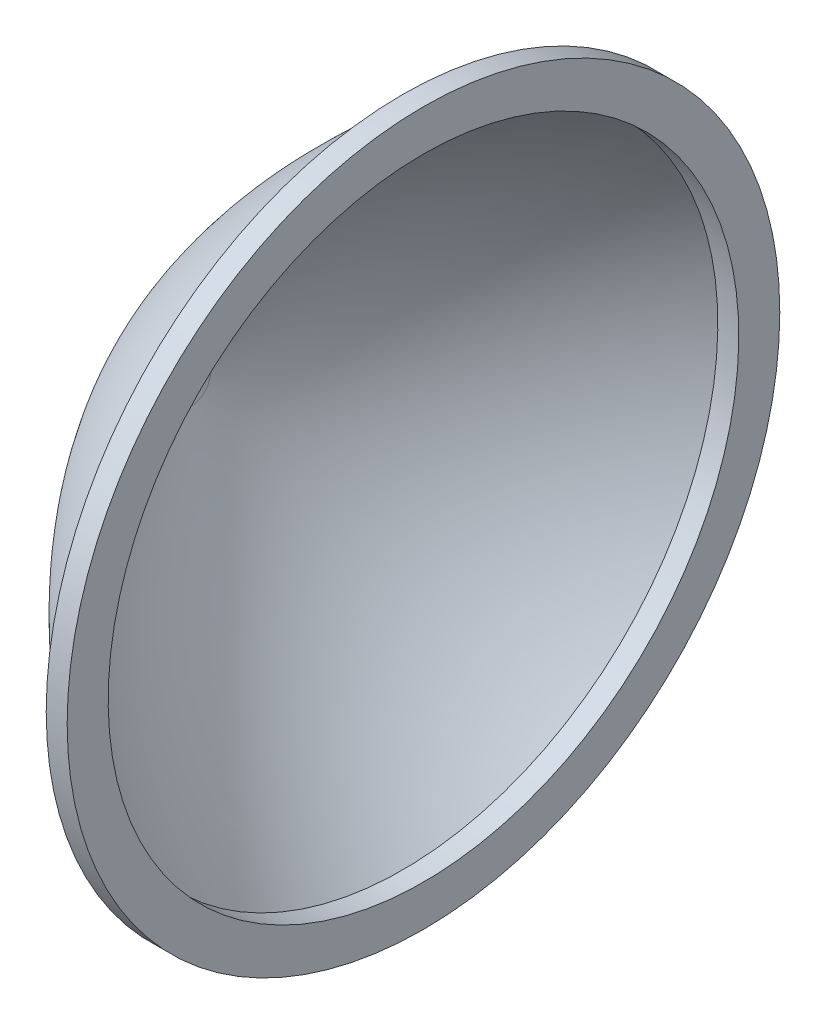
ISO-10303-21;
HEADER;
FILE_DESCRIPTION(('STEP AP214'),'2;1');
FILE_NAME('part.step','',(''),(''),'','','');
FILE_SCHEMA(('AUTOMOTIVE_DESIGN { 1 0 10303 214 1 1 1 1 }'));
ENDSEC;
DATA;
#1=APPLICATION_CONTEXT('core data for automotive mechanical design processes');
#2=APPLICATION_PROTOCOL_DEFINITION('international standard','automotive_design',2000,#1);
#3=PRODUCT_CONTEXT('',#1,'mechanical');
#4=PRODUCT('Part','Part','',(#3));
#5=PRODUCT_RELATED_PRODUCT_CATEGORY('part','',(#4));
#6=PRODUCT_DEFINITION_FORMATION('','',#4);
#7=PRODUCT_DEFINITION_CONTEXT('part definition',#1,'design');
#8=PRODUCT_DEFINITION('design','',#6,#7);
#9=PRODUCT_DEFINITION_SHAPE('','',#8);
#10=(LENGTH_UNIT() NAMED_UNIT(*) SI_UNIT(.MILLI.,.METRE.));
#11=(NAMED_UNIT(*) PLANE_ANGLE_UNIT() SI_UNIT($,.RADIAN.));
#12=(NAMED_UNIT(*) SI_UNIT($,.STERADIAN.) SOLID_ANGLE_UNIT());
#13=UNCERTAINTY_MEASURE_WITH_UNIT(LENGTH_MEASURE(1.E-05),#10,'distance_accuracy_value','');
#14=(GEOMETRIC_REPRESENTATION_CONTEXT(3) GLOBAL_UNCERTAINTY_ASSIGNED_CONTEXT((#13)) GLOBAL_UNIT_ASSIGNED_CONTEXT((#10,
#11,#12)) REPRESENTATION_CONTEXT('',''));
#15=CARTESIAN_POINT('',(0.,0.,0.));
#16=DIRECTION('',(0.,0.,1.));
#17=DIRECTION('',(1.,0.,0.));
#18=AXIS2_PLACEMENT_3D('',#15,#16,#17);
#19=CARTESIAN_POINT('',(-3.99999999661242,65.1715235854003,0.));
#20=CARTESIAN_POINT('',(-38.761790775124,39.7185638460905,0.));
#21=CARTESIAN_POINT('',(-50.,0.,0.));
#22=B_SPLINE_CURVE_WITH_KNOTS('',2,(#19,#20,#21),.UNSPECIFIED.,.F.,.F.,(3,3),
(0.0534390506816608,1.),.UNSPECIFIED.);
#23=CARTESIAN_POINT('',(-45.6419696062031,0.,0.));
#24=DIRECTION('',(1.,0.,0.));
#25=AXIS1_PLACEMENT('',#23,#24);
#26=SURFACE_OF_REVOLUTION('',#22,#25);
#27=CARTESIAN_POINT('',(-50.,0.,0.));
#28=VERTEX_POINT('',#27);
#29=VERTEX_LOOP('',#28);
#30=FACE_BOUND('',#29,.T.);
#31=CARTESIAN_POINT('',(-3.99999999661241,0.,0.));
#32=DIRECTION('',(1.,0.,0.));
#33=DIRECTION('',(0.,1.,0.));
#34=AXIS2_PLACEMENT_3D('',#31,#32,#33);
#35=CIRCLE('',#34,65.1715235854003);
#36=CARTESIAN_POINT('',(-3.99999999661242,65.1715235854003,0.));
#37=VERTEX_POINT('',#36);
#38=EDGE_CURVE('E11',#37,#37,#35,.T.);
#39=ORIENTED_EDGE('',*,*,#38,.F.);
#40=EDGE_LOOP('',(#39));
#41=FACE_BOUND('',#40,.T.);
#42=ADVANCED_FACE('F39',(#30,#41),#26,.F.);
#43=CARTESIAN_POINT('',(-3.99999999661242,65.1715235854003,0.));
#44=DIRECTION('',(-1.,0.,0.));
#45=DIRECTION('',(0.,-1.,0.));
#46=AXIS2_PLACEMENT_3D('',#43,#44,#45);
#47=PLANE('',#46);
#48=ORIENTED_EDGE('',*,*,#38,.T.);
#49=EDGE_LOOP('',(#48));
#50=FACE_BOUND('',#49,.T.);
#51=CARTESIAN_POINT('',(-3.99999999661241,0.,0.));
#52=DIRECTION('',(1.,0.,0.));
#53=DIRECTION('',(0.,1.,0.));
#54=AXIS2_PLACEMENT_3D('',#51,#52,#53);
#55=CIRCLE('',#54,68.);
#56=CARTESIAN_POINT('',(-3.99999999661242,68.,0.));
#57=VERTEX_POINT('',#56);
#58=EDGE_CURVE('E48',#57,#57,#55,.T.);
#59=ORIENTED_EDGE('',*,*,#58,.F.);
#60=EDGE_LOOP('',(#59));
#61=FACE_BOUND('',#60,.T.);
#62=ADVANCED_FACE('F56',(#50,#61),#47,.T.);
#63=CARTESIAN_POINT('',(-45.6419696062031,0.,0.));
#64=DIRECTION('',(1.,0.,0.));
#65=DIRECTION('',(0.,1.,0.));
#66=AXIS2_PLACEMENT_3D('',#63,#64,#65);
#67=CYLINDRICAL_SURFACE('',#66,68.);
#68=ORIENTED_EDGE('',*,*,#58,.T.);
#69=EDGE_LOOP('',(#68));
#70=FACE_BOUND('',#69,.T.);
#71=CARTESIAN_POINT('',(3.38759575946312E-09,0.,0.));
#72=DIRECTION('',(1.,0.,0.));
#73=DIRECTION('',(0.,1.,0.));
#74=AXIS2_PLACEMENT_3D('',#71,#72,#73);
#75=CIRCLE('',#74,68.);
#76=CARTESIAN_POINT('',(3.38758743186489E-09,68.,0.));
#77=VERTEX_POINT('',#76);
#78=EDGE_CURVE('E66',#77,#77,#75,.T.);
#79=ORIENTED_EDGE('',*,*,#78,.F.);
#80=EDGE_LOOP('',(#79));
#81=FACE_BOUND('',#80,.T.);
#82=ADVANCED_FACE('F61',(#70,#81),#67,.T.);
#83=CARTESIAN_POINT('',(3.38758528849071E-09,68.,0.));
#84=DIRECTION('',(1.,0.,0.));
#85=DIRECTION('',(0.,1.,0.));
#86=AXIS2_PLACEMENT_3D('',#83,#84,#85);
#87=PLANE('',#86);
#88=ORIENTED_EDGE('',*,*,#78,.T.);
#89=EDGE_LOOP('',(#88));
#90=FACE_BOUND('',#89,.T.);
#91=CARTESIAN_POINT('',(3.38759575946312E-09,0.,0.));
#92=DIRECTION('',(1.,0.,0.));
#93=DIRECTION('',(0.,1.,0.));
#94=AXIS2_PLACEMENT_3D('',#91,#92,#93);
#95=CIRCLE('',#94,60.1755650897217);
#96=CARTESIAN_POINT('',(3.38758839008181E-09,60.1755650897217,0.));
#97=VERTEX_POINT('',#96);
#98=EDGE_CURVE('E69',#97,#97,#95,.T.);
#99=ORIENTED_EDGE('',*,*,#98,.F.);
#100=EDGE_LOOP('',(#99));
#101=FACE_BOUND('',#100,.T.);
#102=ADVANCED_FACE('F102',(#90,#101),#87,.T.);
#103=CARTESIAN_POINT('',(-45.6419696062031,0.,0.));
#104=DIRECTION('',(1.,0.,0.));
#105=DIRECTION('',(0.,1.,0.));
#106=AXIS2_PLACEMENT_3D('',#103,#104,#105);
#107=CYLINDRICAL_SURFACE('',#106,60.1755650897217);
#108=ORIENTED_EDGE('',*,*,#98,.T.);
#109=EDGE_LOOP('',(#108));
#110=FACE_BOUND('',#109,.T.);
#111=CARTESIAN_POINT('',(-3.99999999661241,0.,0.));
#112=DIRECTION('',(1.,0.,0.));
#113=DIRECTION('',(0.,1.,0.));
#114=AXIS2_PLACEMENT_3D('',#111,#112,#113);
#115=CIRCLE('',#114,60.1755650897217);
#116=CARTESIAN_POINT('',(-3.99999999661241,60.1755650897217,0.));
#117=VERTEX_POINT('',#116);
#118=EDGE_CURVE('E75',#117,#117,#115,.T.);
#119=ORIENTED_EDGE('',*,*,#118,.F.);
#120=EDGE_LOOP('',(#119));
#121=FACE_BOUND('',#120,.T.);
#122=ADVANCED_FACE('F98',(#110,#121),#107,.F.);
#123=CARTESIAN_POINT('',(-44.5915341684731,3.99999999999999,0.));
#124=CARTESIAN_POINT('',(-40.418134085006,16.6205085003349,0.));
#125=CARTESIAN_POINT('',(-29.1934563541197,35.0066162826283,0.));
#126=CARTESIAN_POINT('',(-15.0937928018762,51.6838006866971,0.));
#127=CARTESIAN_POINT('',(-3.99999999661241,60.1755650897217,0.));
#128=B_SPLINE_CURVE_WITH_KNOTS('',2,(#123,#124,#125,#126,#127),.UNSPECIFIED.,.F.,.F.,(3,1,1,3),
(0.086931033049063,0.405562537579464,0.617983540599731,0.936615045130132),.UNSPECIFIED.);
#129=CARTESIAN_POINT('',(-45.6419696062031,0.,0.));
#130=DIRECTION('',(1.,0.,0.));
#131=AXIS1_PLACEMENT('',#129,#130);
#132=SURFACE_OF_REVOLUTION('',#128,#131);
#133=ORIENTED_EDGE('',*,*,#118,.T.);
#134=EDGE_LOOP('',(#133));
#135=FACE_BOUND('',#134,.T.);
#136=CARTESIAN_POINT('',(-44.5915341684731,0.,0.));
#137=DIRECTION('',(1.,0.,0.));
#138=DIRECTION('',(0.,1.,0.));
#139=AXIS2_PLACEMENT_3D('',#136,#137,#138);
#140=CIRCLE('',#139,4.);
#141=CARTESIAN_POINT('',(-44.5915341684731,3.99999999999999,0.));
#142=VERTEX_POINT('',#141);
#143=EDGE_CURVE('E79',#142,#142,#140,.T.);
#144=ORIENTED_EDGE('',*,*,#143,.F.);
#145=EDGE_LOOP('',(#144));
#146=FACE_BOUND('',#145,.T.);
#147=ADVANCED_FACE('F93',(#135,#146),#132,.F.);
#148=CARTESIAN_POINT('',(-45.6419696062031,0.,0.));
#149=DIRECTION('',(1.,0.,0.));
#150=DIRECTION('',(0.,1.,0.));
#151=AXIS2_PLACEMENT_3D('',#148,#149,#150);
#152=CONICAL_SURFACE('',#151,0.,1.3139861571946);
#153=ORIENTED_EDGE('',*,*,#143,.T.);
#154=EDGE_LOOP('',(#153));
#155=FACE_BOUND('',#154,.T.);
#156=CARTESIAN_POINT('',(-45.6419696062031,0.,0.));
#157=VERTEX_POINT('',#156);
#158=VERTEX_LOOP('',#157);
#159=FACE_BOUND('',#158,.T.);
#160=ADVANCED_FACE('F97',(#155,#159),#152,.F.);
#161=CLOSED_SHELL('',(#42,#62,#82,#102,#122,#147,#160));
#162=MANIFOLD_SOLID_BREP('B2',#161);
#163=ADVANCED_BREP_SHAPE_REPRESENTATION('',(#18,#162),#14);
#164=SHAPE_DEFINITION_REPRESENTATION(#9,#163);
ENDSEC;
END-ISO-10303-21;
